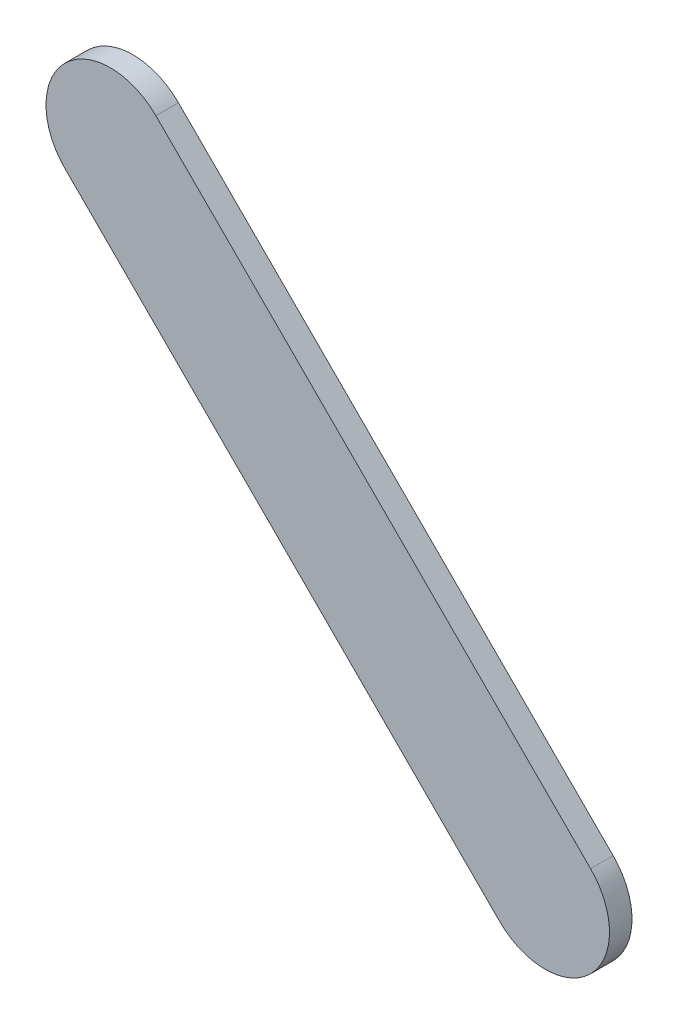
ISO-10303-21;
HEADER;
FILE_DESCRIPTION(('STEP AP214'),'2;1');
FILE_NAME('part.step','',(''),(''),'','','');
FILE_SCHEMA(('AUTOMOTIVE_DESIGN { 1 0 10303 214 1 1 1 1 }'));
ENDSEC;
DATA;
#1=APPLICATION_CONTEXT('core data for automotive mechanical design processes');
#2=APPLICATION_PROTOCOL_DEFINITION('international standard','automotive_design',2000,#1);
#3=PRODUCT_CONTEXT('',#1,'mechanical');
#4=PRODUCT('Part','Part','',(#3));
#5=PRODUCT_RELATED_PRODUCT_CATEGORY('part','',(#4));
#6=PRODUCT_DEFINITION_FORMATION('','',#4);
#7=PRODUCT_DEFINITION_CONTEXT('part definition',#1,'design');
#8=PRODUCT_DEFINITION('design','',#6,#7);
#9=PRODUCT_DEFINITION_SHAPE('','',#8);
#10=(LENGTH_UNIT() NAMED_UNIT(*) SI_UNIT(.MILLI.,.METRE.));
#11=(NAMED_UNIT(*) PLANE_ANGLE_UNIT() SI_UNIT($,.RADIAN.));
#12=(NAMED_UNIT(*) SI_UNIT($,.STERADIAN.) SOLID_ANGLE_UNIT());
#13=UNCERTAINTY_MEASURE_WITH_UNIT(LENGTH_MEASURE(1.E-05),#10,'distance_accuracy_value','');
#14=(GEOMETRIC_REPRESENTATION_CONTEXT(3) GLOBAL_UNCERTAINTY_ASSIGNED_CONTEXT((#13)) GLOBAL_UNIT_ASSIGNED_CONTEXT((#10,
#11,#12)) REPRESENTATION_CONTEXT('',''));
#15=CARTESIAN_POINT('',(0.,0.,0.));
#16=DIRECTION('',(0.,0.,1.));
#17=DIRECTION('',(1.,0.,0.));
#18=AXIS2_PLACEMENT_3D('',#15,#16,#17);
#19=CARTESIAN_POINT('',(91.479289,-118.77071,1.635));
#20=DIRECTION('',(0.,0.,1.));
#21=DIRECTION('',(1.,0.,0.));
#22=AXIS2_PLACEMENT_3D('',#19,#20,#21);
#23=PLANE('',#22);
#24=DIRECTION('',(0.707106781186548,-0.707106781186548,0.));
#25=VECTOR('',#24,1.);
#26=CARTESIAN_POINT('',(91.479289,-118.77071,1.635));
#27=LINE('',#26,#25);
#28=CARTESIAN_POINT('',(91.479289,-118.77071,1.635));
#29=VERTEX_POINT('',#28);
#30=CARTESIAN_POINT('',(92.154289,-119.44571,1.635));
#31=VERTEX_POINT('',#30);
#32=EDGE_CURVE('E80',#29,#31,#27,.T.);
#33=ORIENTED_EDGE('',*,*,#32,.T.);
#34=CARTESIAN_POINT('',(92.2249995,-119.3749995,1.635));
#35=DIRECTION('',(0.,0.,1.));
#36=DIRECTION('',(-0.707106781186048,-0.707106781187047,0.));
#37=AXIS2_PLACEMENT_3D('',#34,#35,#36);
#38=CIRCLE('',#37,0.09999974810219);
#39=CARTESIAN_POINT('',(92.29571,-119.304289,1.635));
#40=VERTEX_POINT('',#39);
#41=EDGE_CURVE('E99',#31,#40,#38,.T.);
#42=ORIENTED_EDGE('',*,*,#41,.T.);
#43=DIRECTION('',(-0.707106781186548,0.707106781186548,0.));
#44=VECTOR('',#43,1.);
#45=CARTESIAN_POINT('',(92.29571,-119.304289,1.635));
#46=LINE('',#45,#44);
#47=CARTESIAN_POINT('',(91.62071,-118.629289,1.635));
#48=VERTEX_POINT('',#47);
#49=EDGE_CURVE('E73',#40,#48,#46,.T.);
#50=ORIENTED_EDGE('',*,*,#49,.T.);
#51=CARTESIAN_POINT('',(91.5499995,-118.6999995,1.635));
#52=DIRECTION('',(0.,0.,1.));
#53=DIRECTION('',(0.707106781187048,0.707106781186048,0.));
#54=AXIS2_PLACEMENT_3D('',#51,#52,#53);
#55=CIRCLE('',#54,0.09999974810218);
#56=EDGE_CURVE('E11',#48,#29,#55,.T.);
#57=ORIENTED_EDGE('',*,*,#56,.T.);
#58=EDGE_LOOP('',(#33,#42,#50,#57));
#59=FACE_BOUND('',#58,.T.);
#60=ADVANCED_FACE('F17',(#59),#23,.T.);
#61=CARTESIAN_POINT('',(91.479289,-118.77071,1.6));
#62=DIRECTION('',(0.,0.,1.));
#63=DIRECTION('',(1.,0.,0.));
#64=AXIS2_PLACEMENT_3D('',#61,#62,#63);
#65=PLANE('',#64);
#66=CARTESIAN_POINT('',(91.5499995,-118.6999995,1.6));
#67=DIRECTION('',(0.,0.,1.));
#68=DIRECTION('',(0.707106781187048,0.707106781186048,0.));
#69=AXIS2_PLACEMENT_3D('',#66,#67,#68);
#70=CIRCLE('',#69,0.09999974810218);
#71=CARTESIAN_POINT('',(91.62071,-118.629289,1.6));
#72=VERTEX_POINT('',#71);
#73=CARTESIAN_POINT('',(91.479289,-118.77071,1.6));
#74=VERTEX_POINT('',#73);
#75=EDGE_CURVE('E27',#72,#74,#70,.T.);
#76=ORIENTED_EDGE('',*,*,#75,.F.);
#77=DIRECTION('',(-0.707106781186548,0.707106781186548,0.));
#78=VECTOR('',#77,1.);
#79=CARTESIAN_POINT('',(92.29571,-119.304289,1.6));
#80=LINE('',#79,#78);
#81=CARTESIAN_POINT('',(92.29571,-119.304289,1.6));
#82=VERTEX_POINT('',#81);
#83=EDGE_CURVE('E97',#82,#72,#80,.T.);
#84=ORIENTED_EDGE('',*,*,#83,.F.);
#85=CARTESIAN_POINT('',(92.2249995,-119.3749995,1.6));
#86=DIRECTION('',(0.,0.,1.));
#87=DIRECTION('',(-0.707106781186048,-0.707106781187047,0.));
#88=AXIS2_PLACEMENT_3D('',#85,#86,#87);
#89=CIRCLE('',#88,0.09999974810219);
#90=CARTESIAN_POINT('',(92.154289,-119.44571,1.6));
#91=VERTEX_POINT('',#90);
#92=EDGE_CURVE('E82',#91,#82,#89,.T.);
#93=ORIENTED_EDGE('',*,*,#92,.F.);
#94=DIRECTION('',(0.707106781186548,-0.707106781186548,0.));
#95=VECTOR('',#94,1.);
#96=CARTESIAN_POINT('',(91.479289,-118.77071,1.6));
#97=LINE('',#96,#95);
#98=EDGE_CURVE('E78',#74,#91,#97,.T.);
#99=ORIENTED_EDGE('',*,*,#98,.F.);
#100=EDGE_LOOP('',(#76,#84,#93,#99));
#101=FACE_BOUND('',#100,.T.);
#102=ADVANCED_FACE('F19',(#101),#65,.F.);
#103=CARTESIAN_POINT('',(91.5499995,-118.6999995,1.6));
#104=DIRECTION('',(0.,0.,-1.));
#105=DIRECTION('',(0.707106781187048,0.707106781186048,0.));
#106=AXIS2_PLACEMENT_3D('',#103,#104,#105);
#107=CYLINDRICAL_SURFACE('',#106,0.09999974810218);
#108=ORIENTED_EDGE('',*,*,#75,.T.);
#109=DIRECTION('',(0.,0.,1.));
#110=VECTOR('',#109,1.);
#111=CARTESIAN_POINT('',(91.479289,-118.77071,1.6));
#112=LINE('',#111,#110);
#113=EDGE_CURVE('E64',#74,#29,#112,.T.);
#114=ORIENTED_EDGE('',*,*,#113,.T.);
#115=ORIENTED_EDGE('',*,*,#56,.F.);
#116=DIRECTION('',(0.,0.,1.));
#117=VECTOR('',#116,1.);
#118=CARTESIAN_POINT('',(91.62071,-118.629289,1.6));
#119=LINE('',#118,#117);
#120=EDGE_CURVE('E67',#72,#48,#119,.T.);
#121=ORIENTED_EDGE('',*,*,#120,.F.);
#122=EDGE_LOOP('',(#108,#114,#115,#121));
#123=FACE_BOUND('',#122,.T.);
#124=ADVANCED_FACE('F63',(#123),#107,.T.);
#125=CARTESIAN_POINT('',(92.29571,-119.304289,1.6));
#126=DIRECTION('',(-0.707106781186548,-0.707106781186548,0.));
#127=DIRECTION('',(-0.707106781186548,0.707106781186548,0.));
#128=AXIS2_PLACEMENT_3D('',#125,#126,#127);
#129=PLANE('',#128);
#130=ORIENTED_EDGE('',*,*,#83,.T.);
#131=ORIENTED_EDGE('',*,*,#120,.T.);
#132=ORIENTED_EDGE('',*,*,#49,.F.);
#133=DIRECTION('',(0.,0.,1.));
#134=VECTOR('',#133,1.);
#135=CARTESIAN_POINT('',(92.29571,-119.304289,1.6));
#136=LINE('',#135,#134);
#137=EDGE_CURVE('E105',#82,#40,#136,.T.);
#138=ORIENTED_EDGE('',*,*,#137,.F.);
#139=EDGE_LOOP('',(#130,#131,#132,#138));
#140=FACE_BOUND('',#139,.T.);
#141=ADVANCED_FACE('F116',(#140),#129,.F.);
#142=CARTESIAN_POINT('',(92.2249995,-119.3749995,1.6));
#143=DIRECTION('',(0.,0.,-1.));
#144=DIRECTION('',(-0.707106781186048,-0.707106781187048,0.));
#145=AXIS2_PLACEMENT_3D('',#142,#143,#144);
#146=CYLINDRICAL_SURFACE('',#145,0.09999974810219);
#147=ORIENTED_EDGE('',*,*,#92,.T.);
#148=ORIENTED_EDGE('',*,*,#137,.T.);
#149=ORIENTED_EDGE('',*,*,#41,.F.);
#150=DIRECTION('',(0.,0.,1.));
#151=VECTOR('',#150,1.);
#152=CARTESIAN_POINT('',(92.154289,-119.44571,1.6));
#153=LINE('',#152,#151);
#154=EDGE_CURVE('E87',#91,#31,#153,.T.);
#155=ORIENTED_EDGE('',*,*,#154,.F.);
#156=EDGE_LOOP('',(#147,#148,#149,#155));
#157=FACE_BOUND('',#156,.T.);
#158=ADVANCED_FACE('F174',(#157),#146,.T.);
#159=CARTESIAN_POINT('',(91.479289,-118.77071,1.6));
#160=DIRECTION('',(0.707106781186548,0.707106781186548,0.));
#161=DIRECTION('',(0.,0.,-1.));
#162=AXIS2_PLACEMENT_3D('',#159,#160,#161);
#163=PLANE('',#162);
#164=ORIENTED_EDGE('',*,*,#98,.T.);
#165=ORIENTED_EDGE('',*,*,#154,.T.);
#166=ORIENTED_EDGE('',*,*,#32,.F.);
#167=ORIENTED_EDGE('',*,*,#113,.F.);
#168=EDGE_LOOP('',(#164,#165,#166,#167));
#169=FACE_BOUND('',#168,.T.);
#170=ADVANCED_FACE('F76',(#169),#163,.F.);
#171=CLOSED_SHELL('',(#60,#102,#124,#141,#158,#170));
#172=MANIFOLD_SOLID_BREP('B1',#171);
#173=ADVANCED_BREP_SHAPE_REPRESENTATION('',(#18,#172),#14);
#174=SHAPE_DEFINITION_REPRESENTATION(#9,#173);
ENDSEC;
END-ISO-10303-21;
